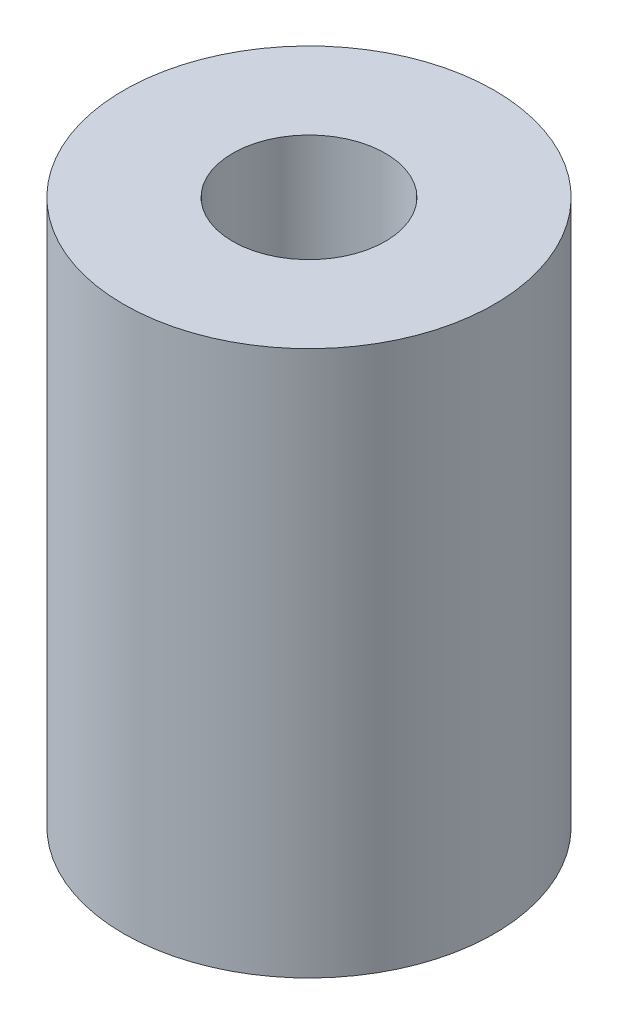
ISO-10303-21;
HEADER;
FILE_DESCRIPTION(('STEP AP214'),'2;1');
FILE_NAME('part.step','',(''),(''),'','','');
FILE_SCHEMA(('AUTOMOTIVE_DESIGN { 1 0 10303 214 1 1 1 1 }'));
ENDSEC;
DATA;
#1=APPLICATION_CONTEXT('core data for automotive mechanical design processes');
#2=APPLICATION_PROTOCOL_DEFINITION('international standard','automotive_design',2000,#1);
#3=PRODUCT_CONTEXT('',#1,'mechanical');
#4=PRODUCT('Part','Part','',(#3));
#5=PRODUCT_RELATED_PRODUCT_CATEGORY('part','',(#4));
#6=PRODUCT_DEFINITION_FORMATION('','',#4);
#7=PRODUCT_DEFINITION_CONTEXT('part definition',#1,'design');
#8=PRODUCT_DEFINITION('design','',#6,#7);
#9=PRODUCT_DEFINITION_SHAPE('','',#8);
#10=(LENGTH_UNIT() NAMED_UNIT(*) SI_UNIT(.MILLI.,.METRE.));
#11=(NAMED_UNIT(*) PLANE_ANGLE_UNIT() SI_UNIT($,.RADIAN.));
#12=(NAMED_UNIT(*) SI_UNIT($,.STERADIAN.) SOLID_ANGLE_UNIT());
#13=UNCERTAINTY_MEASURE_WITH_UNIT(LENGTH_MEASURE(1.E-05),#10,'distance_accuracy_value','');
#14=(GEOMETRIC_REPRESENTATION_CONTEXT(3) GLOBAL_UNCERTAINTY_ASSIGNED_CONTEXT((#13)) GLOBAL_UNIT_ASSIGNED_CONTEXT((#10,
#11,#12)) REPRESENTATION_CONTEXT('',''));
#15=CARTESIAN_POINT('',(0.,0.,0.));
#16=DIRECTION('',(0.,0.,1.));
#17=DIRECTION('',(1.,0.,0.));
#18=AXIS2_PLACEMENT_3D('',#15,#16,#17);
#19=CARTESIAN_POINT('',(0.,15.,0.));
#20=DIRECTION('',(0.,1.,0.));
#21=DIRECTION('',(0.,0.,1.));
#22=AXIS2_PLACEMENT_3D('',#19,#20,#21);
#23=PLANE('',#22);
#24=CARTESIAN_POINT('',(0.,15.,0.));
#25=DIRECTION('',(0.,1.,0.));
#26=DIRECTION('',(0.,0.,1.));
#27=AXIS2_PLACEMENT_3D('',#24,#25,#26);
#28=CIRCLE('',#27,5.1016);
#29=CARTESIAN_POINT('',(0.,15.,5.1016));
#30=VERTEX_POINT('',#29);
#31=EDGE_CURVE('E10',#30,#30,#28,.T.);
#32=ORIENTED_EDGE('',*,*,#31,.T.);
#33=EDGE_LOOP('',(#32));
#34=FACE_BOUND('',#33,.T.);
#35=CARTESIAN_POINT('',(0.,15.,0.));
#36=DIRECTION('',(0.,1.,0.));
#37=DIRECTION('',(0.,0.,1.));
#38=AXIS2_PLACEMENT_3D('',#35,#36,#37);
#39=CIRCLE('',#38,2.1016);
#40=CARTESIAN_POINT('',(0.,15.,2.1016));
#41=VERTEX_POINT('',#40);
#42=EDGE_CURVE('E56',#41,#41,#39,.T.);
#43=ORIENTED_EDGE('',*,*,#42,.F.);
#44=EDGE_LOOP('',(#43));
#45=FACE_BOUND('',#44,.T.);
#46=ADVANCED_FACE('F43',(#34,#45),#23,.T.);
#47=CARTESIAN_POINT('',(0.,0.,0.));
#48=DIRECTION('',(0.,1.,0.));
#49=DIRECTION('',(0.,0.,1.));
#50=AXIS2_PLACEMENT_3D('',#47,#48,#49);
#51=PLANE('',#50);
#52=CARTESIAN_POINT('',(0.,0.,0.));
#53=DIRECTION('',(0.,1.,0.));
#54=DIRECTION('',(0.,0.,1.));
#55=AXIS2_PLACEMENT_3D('',#52,#53,#54);
#56=CIRCLE('',#55,5.1016);
#57=CARTESIAN_POINT('',(0.,0.,5.1016));
#58=VERTEX_POINT('',#57);
#59=EDGE_CURVE('E47',#58,#58,#56,.T.);
#60=ORIENTED_EDGE('',*,*,#59,.F.);
#61=EDGE_LOOP('',(#60));
#62=FACE_BOUND('',#61,.T.);
#63=CARTESIAN_POINT('',(0.,0.,0.));
#64=DIRECTION('',(0.,1.,0.));
#65=DIRECTION('',(0.,0.,1.));
#66=AXIS2_PLACEMENT_3D('',#63,#64,#65);
#67=CIRCLE('',#66,2.1016);
#68=CARTESIAN_POINT('',(0.,0.,2.1016));
#69=VERTEX_POINT('',#68);
#70=EDGE_CURVE('E58',#69,#69,#67,.T.);
#71=ORIENTED_EDGE('',*,*,#70,.T.);
#72=EDGE_LOOP('',(#71));
#73=FACE_BOUND('',#72,.T.);
#74=ADVANCED_FACE('F70',(#62,#73),#51,.F.);
#75=CARTESIAN_POINT('',(0.,15.,0.));
#76=DIRECTION('',(0.,-1.,0.));
#77=DIRECTION('',(0.,0.,-1.));
#78=AXIS2_PLACEMENT_3D('',#75,#76,#77);
#79=CYLINDRICAL_SURFACE('',#78,5.1016);
#80=ORIENTED_EDGE('',*,*,#31,.F.);
#81=EDGE_LOOP('',(#80));
#82=FACE_BOUND('',#81,.T.);
#83=ORIENTED_EDGE('',*,*,#59,.T.);
#84=EDGE_LOOP('',(#83));
#85=FACE_BOUND('',#84,.T.);
#86=ADVANCED_FACE('F45',(#82,#85),#79,.T.);
#87=CARTESIAN_POINT('',(0.,15.,0.));
#88=DIRECTION('',(0.,-1.,0.));
#89=DIRECTION('',(0.,0.,-1.));
#90=AXIS2_PLACEMENT_3D('',#87,#88,#89);
#91=CYLINDRICAL_SURFACE('',#90,2.1016);
#92=ORIENTED_EDGE('',*,*,#42,.T.);
#93=EDGE_LOOP('',(#92));
#94=FACE_BOUND('',#93,.T.);
#95=ORIENTED_EDGE('',*,*,#70,.F.);
#96=EDGE_LOOP('',(#95));
#97=FACE_BOUND('',#96,.T.);
#98=ADVANCED_FACE('F66',(#94,#97),#91,.F.);
#99=CLOSED_SHELL('',(#46,#74,#86,#98));
#100=MANIFOLD_SOLID_BREP('B2',#99);
#101=ADVANCED_BREP_SHAPE_REPRESENTATION('',(#18,#100),#14);
#102=SHAPE_DEFINITION_REPRESENTATION(#9,#101);
ENDSEC;
END-ISO-10303-21;
